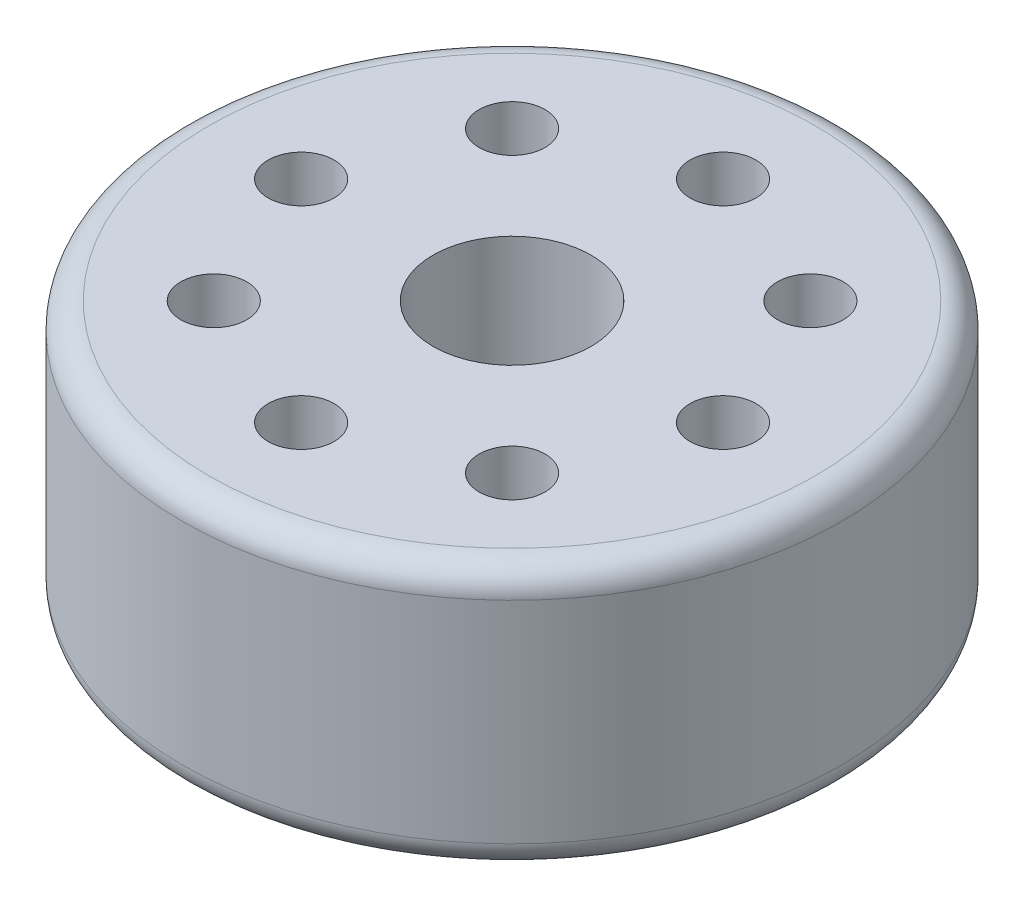
ISO-10303-21;
HEADER;
FILE_DESCRIPTION(('STEP AP214'),'2;1');
FILE_NAME('part.step','',(''),(''),'','','');
FILE_SCHEMA(('AUTOMOTIVE_DESIGN { 1 0 10303 214 1 1 1 1 }'));
ENDSEC;
DATA;
#1=APPLICATION_CONTEXT('core data for automotive mechanical design processes');
#2=APPLICATION_PROTOCOL_DEFINITION('international standard','automotive_design',2000,#1);
#3=PRODUCT_CONTEXT('',#1,'mechanical');
#4=PRODUCT('Part','Part','',(#3));
#5=PRODUCT_RELATED_PRODUCT_CATEGORY('part','',(#4));
#6=PRODUCT_DEFINITION_FORMATION('','',#4);
#7=PRODUCT_DEFINITION_CONTEXT('part definition',#1,'design');
#8=PRODUCT_DEFINITION('design','',#6,#7);
#9=PRODUCT_DEFINITION_SHAPE('','',#8);
#10=(LENGTH_UNIT() NAMED_UNIT(*) SI_UNIT(.MILLI.,.METRE.));
#11=(NAMED_UNIT(*) PLANE_ANGLE_UNIT() SI_UNIT($,.RADIAN.));
#12=(NAMED_UNIT(*) SI_UNIT($,.STERADIAN.) SOLID_ANGLE_UNIT());
#13=UNCERTAINTY_MEASURE_WITH_UNIT(LENGTH_MEASURE(1.E-05),#10,'distance_accuracy_value','');
#14=(GEOMETRIC_REPRESENTATION_CONTEXT(3) GLOBAL_UNCERTAINTY_ASSIGNED_CONTEXT((#13)) GLOBAL_UNIT_ASSIGNED_CONTEXT((#10,
#11,#12)) REPRESENTATION_CONTEXT('',''));
#15=CARTESIAN_POINT('',(0.,0.,0.));
#16=DIRECTION('',(0.,0.,1.));
#17=DIRECTION('',(1.,0.,0.));
#18=AXIS2_PLACEMENT_3D('',#15,#16,#17);
#19=CARTESIAN_POINT('',(0.,10.,0.));
#20=DIRECTION('',(0.,1.,0.));
#21=DIRECTION('',(0.,0.,1.));
#22=AXIS2_PLACEMENT_3D('',#19,#20,#21);
#23=PLANE('',#22);
#24=CARTESIAN_POINT('',(0.,10.,0.));
#25=DIRECTION('',(0.,1.,0.));
#26=DIRECTION('',(0.,0.,1.));
#27=AXIS2_PLACEMENT_3D('',#24,#25,#26);
#28=CIRCLE('',#27,11.5);
#29=CARTESIAN_POINT('',(0.,10.,11.5));
#30=VERTEX_POINT('',#29);
#31=EDGE_CURVE('E10',#30,#30,#28,.T.);
#32=ORIENTED_EDGE('',*,*,#31,.T.);
#33=EDGE_LOOP('',(#32));
#34=FACE_BOUND('',#33,.T.);
#35=CARTESIAN_POINT('',(-8.,10.,0.));
#36=DIRECTION('',(0.,1.,0.));
#37=DIRECTION('',(0.,0.,1.));
#38=AXIS2_PLACEMENT_3D('',#35,#36,#37);
#39=CIRCLE('',#38,1.25);
#40=CARTESIAN_POINT('',(-8.,10.,1.24999999999992));
#41=VERTEX_POINT('',#40);
#42=EDGE_CURVE('E126',#41,#41,#39,.T.);
#43=ORIENTED_EDGE('',*,*,#42,.F.);
#44=EDGE_LOOP('',(#43));
#45=FACE_BOUND('',#44,.T.);
#46=CARTESIAN_POINT('',(2.24434523125278E-13,10.,8.));
#47=DIRECTION('',(0.,1.,0.));
#48=DIRECTION('',(0.,0.,1.));
#49=AXIS2_PLACEMENT_3D('',#46,#47,#48);
#50=CIRCLE('',#49,1.25000000000027);
#51=CARTESIAN_POINT('',(2.24434523125278E-13,10.,9.25000000000027));
#52=VERTEX_POINT('',#51);
#53=EDGE_CURVE('E110',#52,#52,#50,.T.);
#54=ORIENTED_EDGE('',*,*,#53,.F.);
#55=EDGE_LOOP('',(#54));
#56=FACE_BOUND('',#55,.T.);
#57=CARTESIAN_POINT('',(8.,10.,0.));
#58=DIRECTION('',(0.,1.,0.));
#59=DIRECTION('',(0.,0.,1.));
#60=AXIS2_PLACEMENT_3D('',#57,#58,#59);
#61=CIRCLE('',#60,1.25);
#62=CARTESIAN_POINT('',(8.,10.,1.25000000000003));
#63=VERTEX_POINT('',#62);
#64=EDGE_CURVE('E94',#63,#63,#61,.T.);
#65=ORIENTED_EDGE('',*,*,#64,.F.);
#66=EDGE_LOOP('',(#65));
#67=FACE_BOUND('',#66,.T.);
#68=CARTESIAN_POINT('',(5.65685424949239,10.,-5.65685424949237));
#69=DIRECTION('',(0.,1.,0.));
#70=DIRECTION('',(0.,0.,1.));
#71=AXIS2_PLACEMENT_3D('',#68,#69,#70);
#72=CIRCLE('',#71,1.25);
#73=CARTESIAN_POINT('',(5.65685424949239,10.,-4.40685424949237));
#74=VERTEX_POINT('',#73);
#75=EDGE_CURVE('E78',#74,#74,#72,.T.);
#76=ORIENTED_EDGE('',*,*,#75,.F.);
#77=EDGE_LOOP('',(#76));
#78=FACE_BOUND('',#77,.T.);
#79=CARTESIAN_POINT('',(0.,10.,-8.));
#80=DIRECTION('',(0.,1.,0.));
#81=DIRECTION('',(0.,0.,1.));
#82=AXIS2_PLACEMENT_3D('',#79,#80,#81);
#83=CIRCLE('',#82,1.25);
#84=CARTESIAN_POINT('',(0.,10.,-6.75));
#85=VERTEX_POINT('',#84);
#86=EDGE_CURVE('E73',#85,#85,#83,.T.);
#87=ORIENTED_EDGE('',*,*,#86,.F.);
#88=EDGE_LOOP('',(#87));
#89=FACE_BOUND('',#88,.T.);
#90=CARTESIAN_POINT('',(0.,10.,0.));
#91=DIRECTION('',(0.,1.,0.));
#92=DIRECTION('',(0.,0.,1.));
#93=AXIS2_PLACEMENT_3D('',#90,#91,#92);
#94=CIRCLE('',#93,3.);
#95=CARTESIAN_POINT('',(0.,10.,3.));
#96=VERTEX_POINT('',#95);
#97=EDGE_CURVE('E86',#96,#96,#94,.T.);
#98=ORIENTED_EDGE('',*,*,#97,.F.);
#99=EDGE_LOOP('',(#98));
#100=FACE_BOUND('',#99,.T.);
#101=CARTESIAN_POINT('',(5.65685424949235,10.,5.65685424949241));
#102=DIRECTION('',(0.,1.,0.));
#103=DIRECTION('',(0.,0.,1.));
#104=AXIS2_PLACEMENT_3D('',#101,#102,#103);
#105=CIRCLE('',#104,1.25);
#106=CARTESIAN_POINT('',(5.65685424949235,10.,6.90685424949241));
#107=VERTEX_POINT('',#106);
#108=EDGE_CURVE('E102',#107,#107,#105,.T.);
#109=ORIENTED_EDGE('',*,*,#108,.F.);
#110=EDGE_LOOP('',(#109));
#111=FACE_BOUND('',#110,.T.);
#112=CARTESIAN_POINT('',(-5.65685424949243,10.,5.65685424949233));
#113=DIRECTION('',(0.,1.,0.));
#114=DIRECTION('',(0.,0.,1.));
#115=AXIS2_PLACEMENT_3D('',#112,#113,#114);
#116=CIRCLE('',#115,1.25);
#117=CARTESIAN_POINT('',(-5.65685424949243,10.,6.90685424949233));
#118=VERTEX_POINT('',#117);
#119=EDGE_CURVE('E118',#118,#118,#116,.T.);
#120=ORIENTED_EDGE('',*,*,#119,.F.);
#121=EDGE_LOOP('',(#120));
#122=FACE_BOUND('',#121,.T.);
#123=CARTESIAN_POINT('',(-5.65685424949231,10.,-5.65685424949245));
#124=DIRECTION('',(0.,1.,0.));
#125=DIRECTION('',(0.,0.,1.));
#126=AXIS2_PLACEMENT_3D('',#123,#124,#125);
#127=CIRCLE('',#126,1.25);
#128=CARTESIAN_POINT('',(-5.65685424949231,10.,-4.40685424949245));
#129=VERTEX_POINT('',#128);
#130=EDGE_CURVE('E134',#129,#129,#127,.T.);
#131=ORIENTED_EDGE('',*,*,#130,.F.);
#132=EDGE_LOOP('',(#131));
#133=FACE_BOUND('',#132,.T.);
#134=ADVANCED_FACE('F49',(#34,#45,#56,#67,#78,#89,#100,#111,#122,#133),#23,.T.);
#135=CARTESIAN_POINT('',(0.,0.,0.));
#136=DIRECTION('',(0.,1.,0.));
#137=DIRECTION('',(0.,0.,1.));
#138=AXIS2_PLACEMENT_3D('',#135,#136,#137);
#139=PLANE('',#138);
#140=CARTESIAN_POINT('',(0.,0.,0.));
#141=DIRECTION('',(0.,1.,0.));
#142=DIRECTION('',(0.,0.,1.));
#143=AXIS2_PLACEMENT_3D('',#140,#141,#142);
#144=CIRCLE('',#143,11.5);
#145=CARTESIAN_POINT('',(0.,0.,11.5));
#146=VERTEX_POINT('',#145);
#147=EDGE_CURVE('E57',#146,#146,#144,.F.);
#148=ORIENTED_EDGE('',*,*,#147,.T.);
#149=EDGE_LOOP('',(#148));
#150=FACE_BOUND('',#149,.T.);
#151=CARTESIAN_POINT('',(0.,0.,-8.));
#152=DIRECTION('',(0.,1.,0.));
#153=DIRECTION('',(0.,0.,1.));
#154=AXIS2_PLACEMENT_3D('',#151,#152,#153);
#155=CIRCLE('',#154,1.25);
#156=CARTESIAN_POINT('',(0.,0.,-6.75));
#157=VERTEX_POINT('',#156);
#158=EDGE_CURVE('E74',#157,#157,#155,.T.);
#159=ORIENTED_EDGE('',*,*,#158,.T.);
#160=EDGE_LOOP('',(#159));
#161=FACE_BOUND('',#160,.T.);
#162=CARTESIAN_POINT('',(5.65685424949239,0.,-5.65685424949237));
#163=DIRECTION('',(0.,1.,0.));
#164=DIRECTION('',(0.,0.,1.));
#165=AXIS2_PLACEMENT_3D('',#162,#163,#164);
#166=CIRCLE('',#165,1.25);
#167=CARTESIAN_POINT('',(5.65685424949239,0.,-4.40685424949237));
#168=VERTEX_POINT('',#167);
#169=EDGE_CURVE('E82',#168,#168,#166,.T.);
#170=ORIENTED_EDGE('',*,*,#169,.T.);
#171=EDGE_LOOP('',(#170));
#172=FACE_BOUND('',#171,.T.);
#173=CARTESIAN_POINT('',(0.,0.,0.));
#174=DIRECTION('',(0.,1.,0.));
#175=DIRECTION('',(0.,0.,1.));
#176=AXIS2_PLACEMENT_3D('',#173,#174,#175);
#177=CIRCLE('',#176,3.);
#178=CARTESIAN_POINT('',(0.,0.,3.));
#179=VERTEX_POINT('',#178);
#180=EDGE_CURVE('E90',#179,#179,#177,.T.);
#181=ORIENTED_EDGE('',*,*,#180,.T.);
#182=EDGE_LOOP('',(#181));
#183=FACE_BOUND('',#182,.T.);
#184=CARTESIAN_POINT('',(8.,0.,0.));
#185=DIRECTION('',(0.,1.,0.));
#186=DIRECTION('',(0.,0.,1.));
#187=AXIS2_PLACEMENT_3D('',#184,#185,#186);
#188=CIRCLE('',#187,1.25);
#189=CARTESIAN_POINT('',(8.,0.,1.25000000000003));
#190=VERTEX_POINT('',#189);
#191=EDGE_CURVE('E98',#190,#190,#188,.T.);
#192=ORIENTED_EDGE('',*,*,#191,.T.);
#193=EDGE_LOOP('',(#192));
#194=FACE_BOUND('',#193,.T.);
#195=CARTESIAN_POINT('',(5.65685424949235,0.,5.65685424949241));
#196=DIRECTION('',(0.,1.,0.));
#197=DIRECTION('',(0.,0.,1.));
#198=AXIS2_PLACEMENT_3D('',#195,#196,#197);
#199=CIRCLE('',#198,1.25);
#200=CARTESIAN_POINT('',(5.65685424949235,0.,6.90685424949241));
#201=VERTEX_POINT('',#200);
#202=EDGE_CURVE('E106',#201,#201,#199,.T.);
#203=ORIENTED_EDGE('',*,*,#202,.T.);
#204=EDGE_LOOP('',(#203));
#205=FACE_BOUND('',#204,.T.);
#206=CARTESIAN_POINT('',(2.24434523125278E-13,0.,8.));
#207=DIRECTION('',(0.,1.,0.));
#208=DIRECTION('',(0.,0.,1.));
#209=AXIS2_PLACEMENT_3D('',#206,#207,#208);
#210=CIRCLE('',#209,1.25000000000027);
#211=CARTESIAN_POINT('',(2.24434523125278E-13,0.,9.25000000000027));
#212=VERTEX_POINT('',#211);
#213=EDGE_CURVE('E114',#212,#212,#210,.T.);
#214=ORIENTED_EDGE('',*,*,#213,.T.);
#215=EDGE_LOOP('',(#214));
#216=FACE_BOUND('',#215,.T.);
#217=CARTESIAN_POINT('',(-5.65685424949243,0.,5.65685424949233));
#218=DIRECTION('',(0.,1.,0.));
#219=DIRECTION('',(0.,0.,1.));
#220=AXIS2_PLACEMENT_3D('',#217,#218,#219);
#221=CIRCLE('',#220,1.25);
#222=CARTESIAN_POINT('',(-5.65685424949243,0.,6.90685424949233));
#223=VERTEX_POINT('',#222);
#224=EDGE_CURVE('E122',#223,#223,#221,.T.);
#225=ORIENTED_EDGE('',*,*,#224,.T.);
#226=EDGE_LOOP('',(#225));
#227=FACE_BOUND('',#226,.T.);
#228=CARTESIAN_POINT('',(-8.,0.,0.));
#229=DIRECTION('',(0.,1.,0.));
#230=DIRECTION('',(0.,0.,1.));
#231=AXIS2_PLACEMENT_3D('',#228,#229,#230);
#232=CIRCLE('',#231,1.25);
#233=CARTESIAN_POINT('',(-8.,0.,1.24999999999992));
#234=VERTEX_POINT('',#233);
#235=EDGE_CURVE('E130',#234,#234,#232,.T.);
#236=ORIENTED_EDGE('',*,*,#235,.T.);
#237=EDGE_LOOP('',(#236));
#238=FACE_BOUND('',#237,.T.);
#239=CARTESIAN_POINT('',(-5.65685424949231,0.,-5.65685424949245));
#240=DIRECTION('',(0.,1.,0.));
#241=DIRECTION('',(0.,0.,1.));
#242=AXIS2_PLACEMENT_3D('',#239,#240,#241);
#243=CIRCLE('',#242,1.25);
#244=CARTESIAN_POINT('',(-5.65685424949231,0.,-4.40685424949245));
#245=VERTEX_POINT('',#244);
#246=EDGE_CURVE('E138',#245,#245,#243,.T.);
#247=ORIENTED_EDGE('',*,*,#246,.T.);
#248=EDGE_LOOP('',(#247));
#249=FACE_BOUND('',#248,.T.);
#250=ADVANCED_FACE('F150',(#150,#161,#172,#183,#194,#205,#216,#227,#238,#249),#139,.F.);
#251=CARTESIAN_POINT('',(0.,10.,0.));
#252=DIRECTION('',(0.,-1.,0.));
#253=DIRECTION('',(0.,0.,-1.));
#254=AXIS2_PLACEMENT_3D('',#251,#252,#253);
#255=CYLINDRICAL_SURFACE('',#254,12.5);
#256=CARTESIAN_POINT('',(0.,0.999999999999999,0.));
#257=DIRECTION('',(0.,1.,0.));
#258=DIRECTION('',(0.,0.,1.));
#259=AXIS2_PLACEMENT_3D('',#256,#257,#258);
#260=CIRCLE('',#259,12.5);
#261=CARTESIAN_POINT('',(0.,0.999999999999999,12.5));
#262=VERTEX_POINT('',#261);
#263=EDGE_CURVE('E62',#262,#262,#260,.T.);
#264=ORIENTED_EDGE('',*,*,#263,.T.);
#265=EDGE_LOOP('',(#264));
#266=FACE_BOUND('',#265,.T.);
#267=CARTESIAN_POINT('',(0.,9.,0.));
#268=DIRECTION('',(0.,1.,0.));
#269=DIRECTION('',(0.,0.,1.));
#270=AXIS2_PLACEMENT_3D('',#267,#268,#269);
#271=CIRCLE('',#270,12.5);
#272=CARTESIAN_POINT('',(0.,9.,12.5));
#273=VERTEX_POINT('',#272);
#274=EDGE_CURVE('E67',#273,#273,#271,.F.);
#275=ORIENTED_EDGE('',*,*,#274,.T.);
#276=EDGE_LOOP('',(#275));
#277=FACE_BOUND('',#276,.T.);
#278=ADVANCED_FACE('F156',(#266,#277),#255,.T.);
#279=CARTESIAN_POINT('',(0.,10.,-8.));
#280=DIRECTION('',(0.,-1.,0.));
#281=DIRECTION('',(0.,0.,-1.));
#282=AXIS2_PLACEMENT_3D('',#279,#280,#281);
#283=CYLINDRICAL_SURFACE('',#282,1.25);
#284=ORIENTED_EDGE('',*,*,#86,.T.);
#285=EDGE_LOOP('',(#284));
#286=FACE_BOUND('',#285,.T.);
#287=ORIENTED_EDGE('',*,*,#158,.F.);
#288=EDGE_LOOP('',(#287));
#289=FACE_BOUND('',#288,.T.);
#290=ADVANCED_FACE('F160',(#286,#289),#283,.F.);
#291=CARTESIAN_POINT('',(5.65685424949239,10.,-5.65685424949237));
#292=DIRECTION('',(0.,-1.,0.));
#293=DIRECTION('',(0.,0.,-1.));
#294=AXIS2_PLACEMENT_3D('',#291,#292,#293);
#295=CYLINDRICAL_SURFACE('',#294,1.25);
#296=ORIENTED_EDGE('',*,*,#75,.T.);
#297=EDGE_LOOP('',(#296));
#298=FACE_BOUND('',#297,.T.);
#299=ORIENTED_EDGE('',*,*,#169,.F.);
#300=EDGE_LOOP('',(#299));
#301=FACE_BOUND('',#300,.T.);
#302=ADVANCED_FACE('F204',(#298,#301),#295,.F.);
#303=CARTESIAN_POINT('',(0.,10.,0.));
#304=DIRECTION('',(0.,-1.,0.));
#305=DIRECTION('',(0.,0.,-1.));
#306=AXIS2_PLACEMENT_3D('',#303,#304,#305);
#307=CYLINDRICAL_SURFACE('',#306,3.);
#308=ORIENTED_EDGE('',*,*,#97,.T.);
#309=EDGE_LOOP('',(#308));
#310=FACE_BOUND('',#309,.T.);
#311=ORIENTED_EDGE('',*,*,#180,.F.);
#312=EDGE_LOOP('',(#311));
#313=FACE_BOUND('',#312,.T.);
#314=ADVANCED_FACE('F201',(#310,#313),#307,.F.);
#315=CARTESIAN_POINT('',(8.,10.,0.));
#316=DIRECTION('',(0.,-1.,0.));
#317=DIRECTION('',(0.,0.,-1.));
#318=AXIS2_PLACEMENT_3D('',#315,#316,#317);
#319=CYLINDRICAL_SURFACE('',#318,1.25);
#320=ORIENTED_EDGE('',*,*,#64,.T.);
#321=EDGE_LOOP('',(#320));
#322=FACE_BOUND('',#321,.T.);
#323=ORIENTED_EDGE('',*,*,#191,.F.);
#324=EDGE_LOOP('',(#323));
#325=FACE_BOUND('',#324,.T.);
#326=ADVANCED_FACE('F197',(#322,#325),#319,.F.);
#327=CARTESIAN_POINT('',(5.65685424949235,10.,5.65685424949241));
#328=DIRECTION('',(0.,-1.,0.));
#329=DIRECTION('',(0.,0.,-1.));
#330=AXIS2_PLACEMENT_3D('',#327,#328,#329);
#331=CYLINDRICAL_SURFACE('',#330,1.25);
#332=ORIENTED_EDGE('',*,*,#108,.T.);
#333=EDGE_LOOP('',(#332));
#334=FACE_BOUND('',#333,.T.);
#335=ORIENTED_EDGE('',*,*,#202,.F.);
#336=EDGE_LOOP('',(#335));
#337=FACE_BOUND('',#336,.T.);
#338=ADVANCED_FACE('F193',(#334,#337),#331,.F.);
#339=CARTESIAN_POINT('',(2.24434523125278E-13,10.,8.));
#340=DIRECTION('',(0.,-1.,0.));
#341=DIRECTION('',(0.,0.,-1.));
#342=AXIS2_PLACEMENT_3D('',#339,#340,#341);
#343=CYLINDRICAL_SURFACE('',#342,1.25000000000027);
#344=ORIENTED_EDGE('',*,*,#53,.T.);
#345=EDGE_LOOP('',(#344));
#346=FACE_BOUND('',#345,.T.);
#347=ORIENTED_EDGE('',*,*,#213,.F.);
#348=EDGE_LOOP('',(#347));
#349=FACE_BOUND('',#348,.T.);
#350=ADVANCED_FACE('F189',(#346,#349),#343,.F.);
#351=CARTESIAN_POINT('',(-5.65685424949243,10.,5.65685424949233));
#352=DIRECTION('',(0.,-1.,0.));
#353=DIRECTION('',(0.,0.,-1.));
#354=AXIS2_PLACEMENT_3D('',#351,#352,#353);
#355=CYLINDRICAL_SURFACE('',#354,1.25);
#356=ORIENTED_EDGE('',*,*,#119,.T.);
#357=EDGE_LOOP('',(#356));
#358=FACE_BOUND('',#357,.T.);
#359=ORIENTED_EDGE('',*,*,#224,.F.);
#360=EDGE_LOOP('',(#359));
#361=FACE_BOUND('',#360,.T.);
#362=ADVANCED_FACE('F183',(#358,#361),#355,.F.);
#363=CARTESIAN_POINT('',(-8.,10.,0.));
#364=DIRECTION('',(0.,-1.,0.));
#365=DIRECTION('',(0.,0.,-1.));
#366=AXIS2_PLACEMENT_3D('',#363,#364,#365);
#367=CYLINDRICAL_SURFACE('',#366,1.25);
#368=ORIENTED_EDGE('',*,*,#42,.T.);
#369=EDGE_LOOP('',(#368));
#370=FACE_BOUND('',#369,.T.);
#371=ORIENTED_EDGE('',*,*,#235,.F.);
#372=EDGE_LOOP('',(#371));
#373=FACE_BOUND('',#372,.T.);
#374=ADVANCED_FACE('F173',(#370,#373),#367,.F.);
#375=CARTESIAN_POINT('',(-5.65685424949231,10.,-5.65685424949245));
#376=DIRECTION('',(0.,-1.,0.));
#377=DIRECTION('',(0.,0.,-1.));
#378=AXIS2_PLACEMENT_3D('',#375,#376,#377);
#379=CYLINDRICAL_SURFACE('',#378,1.25);
#380=ORIENTED_EDGE('',*,*,#130,.T.);
#381=EDGE_LOOP('',(#380));
#382=FACE_BOUND('',#381,.T.);
#383=ORIENTED_EDGE('',*,*,#246,.F.);
#384=EDGE_LOOP('',(#383));
#385=FACE_BOUND('',#384,.T.);
#386=ADVANCED_FACE('F146',(#382,#385),#379,.F.);
#387=CARTESIAN_POINT('',(0.,0.999999999999999,0.));
#388=DIRECTION('',(0.,1.,0.));
#389=DIRECTION('',(0.,0.,1.));
#390=AXIS2_PLACEMENT_3D('',#387,#388,#389);
#391=TOROIDAL_SURFACE('',#390,11.5,1.);
#392=ORIENTED_EDGE('',*,*,#147,.F.);
#393=EDGE_LOOP('',(#392));
#394=FACE_BOUND('',#393,.T.);
#395=ORIENTED_EDGE('',*,*,#263,.F.);
#396=EDGE_LOOP('',(#395));
#397=FACE_BOUND('',#396,.T.);
#398=ADVANCED_FACE('F165',(#394,#397),#391,.T.);
#399=CARTESIAN_POINT('',(0.,9.,0.));
#400=DIRECTION('',(0.,1.,0.));
#401=DIRECTION('',(0.,0.,1.));
#402=AXIS2_PLACEMENT_3D('',#399,#400,#401);
#403=TOROIDAL_SURFACE('',#402,11.5,1.);
#404=ORIENTED_EDGE('',*,*,#274,.F.);
#405=EDGE_LOOP('',(#404));
#406=FACE_BOUND('',#405,.T.);
#407=ORIENTED_EDGE('',*,*,#31,.F.);
#408=EDGE_LOOP('',(#407));
#409=FACE_BOUND('',#408,.T.);
#410=ADVANCED_FACE('F51',(#406,#409),#403,.T.);
#411=CLOSED_SHELL('',(#134,#250,#278,#290,#302,#314,#326,#338,#350,#362,#374,#386,#398,#410));
#412=MANIFOLD_SOLID_BREP('B2',#411);
#413=ADVANCED_BREP_SHAPE_REPRESENTATION('',(#18,#412),#14);
#414=SHAPE_DEFINITION_REPRESENTATION(#9,#413);
ENDSEC;
END-ISO-10303-21;
